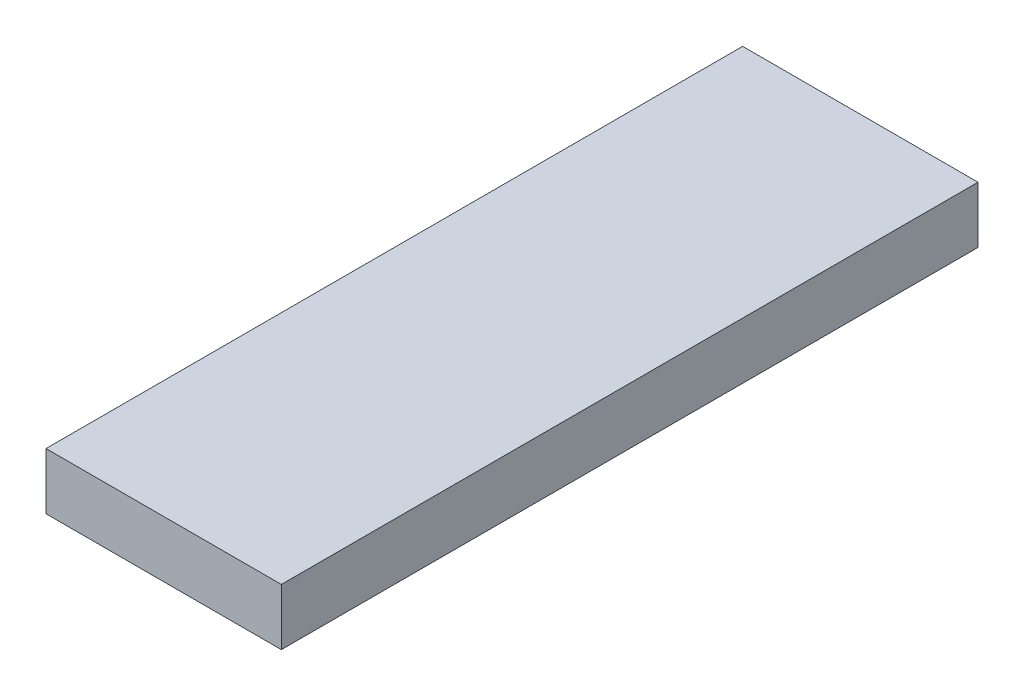
ISO-10303-21;
HEADER;
FILE_DESCRIPTION(('STEP AP214'),'2;1');
FILE_NAME('part.step','',(''),(''),'','','');
FILE_SCHEMA(('AUTOMOTIVE_DESIGN { 1 0 10303 214 1 1 1 1 }'));
ENDSEC;
DATA;
#1=APPLICATION_CONTEXT('core data for automotive mechanical design processes');
#2=APPLICATION_PROTOCOL_DEFINITION('international standard','automotive_design',2000,#1);
#3=PRODUCT_CONTEXT('',#1,'mechanical');
#4=PRODUCT('Part','Part','',(#3));
#5=PRODUCT_RELATED_PRODUCT_CATEGORY('part','',(#4));
#6=PRODUCT_DEFINITION_FORMATION('','',#4);
#7=PRODUCT_DEFINITION_CONTEXT('part definition',#1,'design');
#8=PRODUCT_DEFINITION('design','',#6,#7);
#9=PRODUCT_DEFINITION_SHAPE('','',#8);
#10=(LENGTH_UNIT() NAMED_UNIT(*) SI_UNIT(.MILLI.,.METRE.));
#11=(NAMED_UNIT(*) PLANE_ANGLE_UNIT() SI_UNIT($,.RADIAN.));
#12=(NAMED_UNIT(*) SI_UNIT($,.STERADIAN.) SOLID_ANGLE_UNIT());
#13=UNCERTAINTY_MEASURE_WITH_UNIT(LENGTH_MEASURE(1.E-05),#10,'distance_accuracy_value','');
#14=(GEOMETRIC_REPRESENTATION_CONTEXT(3) GLOBAL_UNCERTAINTY_ASSIGNED_CONTEXT((#13)) GLOBAL_UNIT_ASSIGNED_CONTEXT((#10,
#11,#12)) REPRESENTATION_CONTEXT('',''));
#15=CARTESIAN_POINT('',(0.,0.,0.));
#16=DIRECTION('',(0.,0.,1.));
#17=DIRECTION('',(1.,0.,0.));
#18=AXIS2_PLACEMENT_3D('',#15,#16,#17);
#19=CARTESIAN_POINT('',(-3.78151254869309,0.750300140878623,0.));
#20=DIRECTION('',(0.,1.,0.));
#21=DIRECTION('',(0.,0.,1.));
#22=AXIS2_PLACEMENT_3D('',#19,#20,#21);
#23=PLANE('',#22);
#24=DIRECTION('',(1.,0.,0.));
#25=VECTOR('',#24,1.);
#26=CARTESIAN_POINT('',(-3.15651254869309,0.750300140878623,0.));
#27=LINE('',#26,#25);
#28=CARTESIAN_POINT('',(-2.53151254869309,0.750300140878623,0.));
#29=VERTEX_POINT('',#28);
#30=CARTESIAN_POINT('',(-3.78151254869309,0.750300140878623,0.));
#31=VERTEX_POINT('',#30);
#32=EDGE_CURVE('E68',#29,#31,#27,.F.);
#33=ORIENTED_EDGE('',*,*,#32,.T.);
#34=DIRECTION('',(0.,0.,1.));
#35=VECTOR('',#34,1.);
#36=CARTESIAN_POINT('',(-3.78151254869309,0.750300140878623,0.));
#37=LINE('',#36,#35);
#38=CARTESIAN_POINT('',(-3.78151254869309,0.750300140878623,3.7));
#39=VERTEX_POINT('',#38);
#40=EDGE_CURVE('E55',#39,#31,#37,.F.);
#41=ORIENTED_EDGE('',*,*,#40,.F.);
#42=DIRECTION('',(1.,0.,0.));
#43=VECTOR('',#42,1.);
#44=CARTESIAN_POINT('',(-3.15651254869309,0.750300140878623,3.7));
#45=LINE('',#44,#43);
#46=CARTESIAN_POINT('',(-2.53151254869309,0.750300140878623,3.7));
#47=VERTEX_POINT('',#46);
#48=EDGE_CURVE('E20',#47,#39,#45,.F.);
#49=ORIENTED_EDGE('',*,*,#48,.F.);
#50=DIRECTION('',(0.,0.,-1.));
#51=VECTOR('',#50,1.);
#52=CARTESIAN_POINT('',(-2.53151254869309,0.750300140878623,0.));
#53=LINE('',#52,#51);
#54=EDGE_CURVE('E81',#29,#47,#53,.F.);
#55=ORIENTED_EDGE('',*,*,#54,.F.);
#56=EDGE_LOOP('',(#33,#41,#49,#55));
#57=FACE_BOUND('',#56,.T.);
#58=ADVANCED_FACE('F17',(#57),#23,.T.);
#59=CARTESIAN_POINT('',(-3.15651254869309,0.600300140878623,3.7));
#60=DIRECTION('',(0.,0.,1.));
#61=DIRECTION('',(1.,0.,0.));
#62=AXIS2_PLACEMENT_3D('',#59,#60,#61);
#63=PLANE('',#62);
#64=DIRECTION('',(0.,1.,0.));
#65=VECTOR('',#64,1.);
#66=CARTESIAN_POINT('',(-3.78151254869309,0.450300140878623,3.7));
#67=LINE('',#66,#65);
#68=CARTESIAN_POINT('',(-3.78151254869309,0.450300140878623,3.7));
#69=VERTEX_POINT('',#68);
#70=EDGE_CURVE('E61',#69,#39,#67,.T.);
#71=ORIENTED_EDGE('',*,*,#70,.F.);
#72=DIRECTION('',(1.,0.,0.));
#73=VECTOR('',#72,1.);
#74=CARTESIAN_POINT('',(-2.53151254869309,0.450300140878623,3.7));
#75=LINE('',#74,#73);
#76=CARTESIAN_POINT('',(-2.53151254869309,0.450300140878623,3.7));
#77=VERTEX_POINT('',#76);
#78=EDGE_CURVE('E83',#77,#69,#75,.F.);
#79=ORIENTED_EDGE('',*,*,#78,.F.);
#80=DIRECTION('',(0.,1.,0.));
#81=VECTOR('',#80,1.);
#82=CARTESIAN_POINT('',(-2.53151254869309,0.750300140878623,3.7));
#83=LINE('',#82,#81);
#84=EDGE_CURVE('E64',#47,#77,#83,.F.);
#85=ORIENTED_EDGE('',*,*,#84,.F.);
#86=ORIENTED_EDGE('',*,*,#48,.T.);
#87=EDGE_LOOP('',(#71,#79,#85,#86));
#88=FACE_BOUND('',#87,.T.);
#89=ADVANCED_FACE('F60',(#88),#63,.T.);
#90=CARTESIAN_POINT('',(-3.78151254869309,0.450300140878623,0.));
#91=DIRECTION('',(-1.,0.,0.));
#92=DIRECTION('',(0.,0.,1.));
#93=AXIS2_PLACEMENT_3D('',#90,#91,#92);
#94=PLANE('',#93);
#95=DIRECTION('',(0.,1.,0.));
#96=VECTOR('',#95,1.);
#97=CARTESIAN_POINT('',(-3.78151254869309,0.600300140878623,0.));
#98=LINE('',#97,#96);
#99=CARTESIAN_POINT('',(-3.78151254869309,0.450300140878623,0.));
#100=VERTEX_POINT('',#99);
#101=EDGE_CURVE('E70',#31,#100,#98,.F.);
#102=ORIENTED_EDGE('',*,*,#101,.T.);
#103=DIRECTION('',(0.,0.,-1.));
#104=VECTOR('',#103,1.);
#105=CARTESIAN_POINT('',(-3.78151254869309,0.450300140878623,0.));
#106=LINE('',#105,#104);
#107=EDGE_CURVE('E74',#69,#100,#106,.T.);
#108=ORIENTED_EDGE('',*,*,#107,.F.);
#109=ORIENTED_EDGE('',*,*,#70,.T.);
#110=ORIENTED_EDGE('',*,*,#40,.T.);
#111=EDGE_LOOP('',(#102,#108,#109,#110));
#112=FACE_BOUND('',#111,.T.);
#113=ADVANCED_FACE('F72',(#112),#94,.T.);
#114=CARTESIAN_POINT('',(-3.15651254869309,0.600300140878623,0.));
#115=DIRECTION('',(0.,0.,1.));
#116=DIRECTION('',(1.,0.,0.));
#117=AXIS2_PLACEMENT_3D('',#114,#115,#116);
#118=PLANE('',#117);
#119=DIRECTION('',(0.,1.,0.));
#120=VECTOR('',#119,1.);
#121=CARTESIAN_POINT('',(-2.53151254869309,0.750300140878623,0.));
#122=LINE('',#121,#120);
#123=CARTESIAN_POINT('',(-2.53151254869309,0.450300140878623,0.));
#124=VERTEX_POINT('',#123);
#125=EDGE_CURVE('E35',#124,#29,#122,.T.);
#126=ORIENTED_EDGE('',*,*,#125,.F.);
#127=DIRECTION('',(1.,0.,0.));
#128=VECTOR('',#127,1.);
#129=CARTESIAN_POINT('',(-2.53151254869309,0.450300140878623,0.));
#130=LINE('',#129,#128);
#131=EDGE_CURVE('E26',#100,#124,#130,.T.);
#132=ORIENTED_EDGE('',*,*,#131,.F.);
#133=ORIENTED_EDGE('',*,*,#101,.F.);
#134=ORIENTED_EDGE('',*,*,#32,.F.);
#135=EDGE_LOOP('',(#126,#132,#133,#134));
#136=FACE_BOUND('',#135,.T.);
#137=ADVANCED_FACE('F89',(#136),#118,.F.);
#138=CARTESIAN_POINT('',(-2.53151254869309,0.750300140878623,0.));
#139=DIRECTION('',(1.,0.,0.));
#140=DIRECTION('',(0.,0.,-1.));
#141=AXIS2_PLACEMENT_3D('',#138,#139,#140);
#142=PLANE('',#141);
#143=ORIENTED_EDGE('',*,*,#125,.T.);
#144=ORIENTED_EDGE('',*,*,#54,.T.);
#145=ORIENTED_EDGE('',*,*,#84,.T.);
#146=DIRECTION('',(0.,0.,-1.));
#147=VECTOR('',#146,1.);
#148=CARTESIAN_POINT('',(-2.53151254869309,0.450300140878623,0.));
#149=LINE('',#148,#147);
#150=EDGE_CURVE('E11',#124,#77,#149,.F.);
#151=ORIENTED_EDGE('',*,*,#150,.F.);
#152=EDGE_LOOP('',(#143,#144,#145,#151));
#153=FACE_BOUND('',#152,.T.);
#154=ADVANCED_FACE('F91',(#153),#142,.T.);
#155=CARTESIAN_POINT('',(-2.53151254869309,0.450300140878623,0.));
#156=DIRECTION('',(0.,-1.,0.));
#157=DIRECTION('',(0.,0.,-1.));
#158=AXIS2_PLACEMENT_3D('',#155,#156,#157);
#159=PLANE('',#158);
#160=ORIENTED_EDGE('',*,*,#131,.T.);
#161=ORIENTED_EDGE('',*,*,#150,.T.);
#162=ORIENTED_EDGE('',*,*,#78,.T.);
#163=ORIENTED_EDGE('',*,*,#107,.T.);
#164=EDGE_LOOP('',(#160,#161,#162,#163));
#165=FACE_BOUND('',#164,.T.);
#166=ADVANCED_FACE('F88',(#165),#159,.T.);
#167=CLOSED_SHELL('',(#58,#89,#113,#137,#154,#166));
#168=MANIFOLD_SOLID_BREP('B1',#167);
#169=ADVANCED_BREP_SHAPE_REPRESENTATION('',(#18,#168),#14);
#170=SHAPE_DEFINITION_REPRESENTATION(#9,#169);
ENDSEC;
END-ISO-10303-21;
